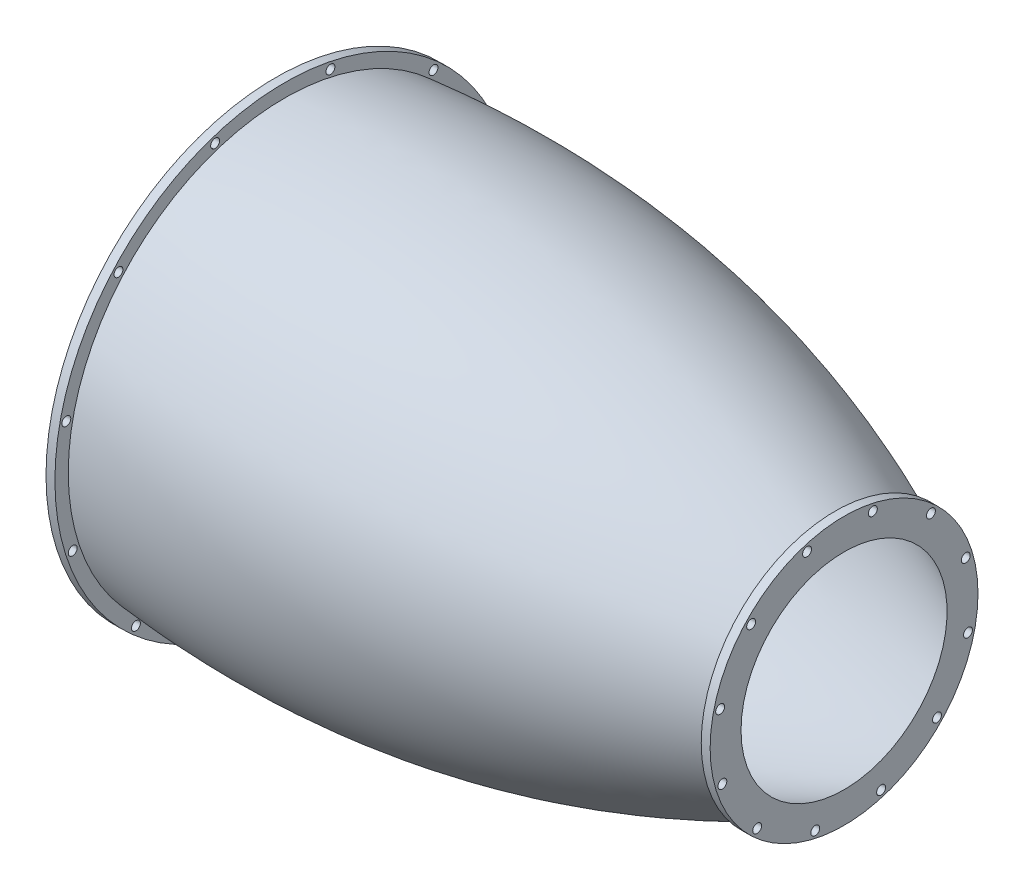
ISO-10303-21;
HEADER;
FILE_DESCRIPTION(('STEP AP214'),'2;1');
FILE_NAME('part.step','',(''),(''),'','','');
FILE_SCHEMA(('AUTOMOTIVE_DESIGN { 1 0 10303 214 1 1 1 1 }'));
ENDSEC;
DATA;
#1=APPLICATION_CONTEXT('core data for automotive mechanical design processes');
#2=APPLICATION_PROTOCOL_DEFINITION('international standard','automotive_design',2000,#1);
#3=PRODUCT_CONTEXT('',#1,'mechanical');
#4=PRODUCT('Part','Part','',(#3));
#5=PRODUCT_RELATED_PRODUCT_CATEGORY('part','',(#4));
#6=PRODUCT_DEFINITION_FORMATION('','',#4);
#7=PRODUCT_DEFINITION_CONTEXT('part definition',#1,'design');
#8=PRODUCT_DEFINITION('design','',#6,#7);
#9=PRODUCT_DEFINITION_SHAPE('','',#8);
#10=(LENGTH_UNIT() NAMED_UNIT(*) SI_UNIT(.MILLI.,.METRE.));
#11=(NAMED_UNIT(*) PLANE_ANGLE_UNIT() SI_UNIT($,.RADIAN.));
#12=(NAMED_UNIT(*) SI_UNIT($,.STERADIAN.) SOLID_ANGLE_UNIT());
#13=UNCERTAINTY_MEASURE_WITH_UNIT(LENGTH_MEASURE(1.E-05),#10,'distance_accuracy_value','');
#14=(GEOMETRIC_REPRESENTATION_CONTEXT(3) GLOBAL_UNCERTAINTY_ASSIGNED_CONTEXT((#13)) GLOBAL_UNIT_ASSIGNED_CONTEXT((#10,
#11,#12)) REPRESENTATION_CONTEXT('',''));
#15=CARTESIAN_POINT('',(0.,0.,0.));
#16=DIRECTION('',(0.,0.,1.));
#17=DIRECTION('',(1.,0.,0.));
#18=AXIS2_PLACEMENT_3D('',#15,#16,#17);
#19=CARTESIAN_POINT('',(-406.474178467712,0.,0.));
#20=DIRECTION('',(-1.,0.,0.));
#21=DIRECTION('',(0.,0.,1.));
#22=AXIS2_PLACEMENT_3D('',#19,#20,#21);
#23=PLANE('',#22);
#24=CARTESIAN_POINT('',(-406.474178467712,-151.163842279478,-49.6198833128808));
#25=DIRECTION('',(1.,0.,0.));
#26=DIRECTION('',(0.,0.500000000000001,-0.866025403784438));
#27=AXIS2_PLACEMENT_3D('',#24,#25,#26);
#28=CIRCLE('',#27,3.17499999999998);
#29=CARTESIAN_POINT('',(-406.474178467712,-149.576342279478,-52.3695139698964));
#30=VERTEX_POINT('',#29);
#31=EDGE_CURVE('E245',#30,#30,#28,.T.);
#32=ORIENTED_EDGE('',*,*,#31,.F.);
#33=EDGE_LOOP('',(#32));
#34=FACE_BOUND('',#33,.T.);
#35=CARTESIAN_POINT('',(-406.474178467712,-118.554000621515,106.101785891251));
#36=DIRECTION('',(1.,0.,0.));
#37=DIRECTION('',(0.,-0.499999999999989,-0.866025403784445));
#38=AXIS2_PLACEMENT_3D('',#35,#36,#37);
#39=CIRCLE('',#38,3.17499999999998);
#40=CARTESIAN_POINT('',(-406.474178467712,-120.141500621515,103.352155234235));
#41=VERTEX_POINT('',#40);
#42=EDGE_CURVE('E312',#41,#41,#39,.T.);
#43=ORIENTED_EDGE('',*,*,#42,.F.);
#44=EDGE_LOOP('',(#43));
#45=FACE_BOUND('',#44,.T.);
#46=CARTESIAN_POINT('',(-406.474178467712,-49.6198833128824,151.163842279478));
#47=DIRECTION('',(1.,0.,0.));
#48=DIRECTION('',(0.,-0.866025403784433,-0.50000000000001));
#49=AXIS2_PLACEMENT_3D('',#46,#47,#48);
#50=CIRCLE('',#49,3.17499999999998);
#51=CARTESIAN_POINT('',(-406.474178467712,-52.369513969898,149.576342279478));
#52=VERTEX_POINT('',#51);
#53=EDGE_CURVE('E255',#52,#52,#50,.T.);
#54=ORIENTED_EDGE('',*,*,#53,.F.);
#55=EDGE_LOOP('',(#54));
#56=FACE_BOUND('',#55,.T.);
#57=CARTESIAN_POINT('',(-406.474178467712,32.6098416579633,155.721669204133));
#58=DIRECTION('',(1.,0.,0.));
#59=DIRECTION('',(0.,-1.,0.));
#60=AXIS2_PLACEMENT_3D('',#57,#58,#59);
#61=CIRCLE('',#60,3.17499999999998);
#62=CARTESIAN_POINT('',(-406.474178467712,29.4348416579633,155.721669204133));
#63=VERTEX_POINT('',#62);
#64=EDGE_CURVE('E246',#63,#63,#61,.T.);
#65=ORIENTED_EDGE('',*,*,#64,.F.);
#66=EDGE_LOOP('',(#65));
#67=FACE_BOUND('',#66,.T.);
#68=CARTESIAN_POINT('',(-406.474178467712,106.101785891251,118.554000621514));
#69=DIRECTION('',(1.,0.,0.));
#70=DIRECTION('',(0.,-0.866025403784443,0.499999999999992));
#71=AXIS2_PLACEMENT_3D('',#68,#69,#70);
#72=CIRCLE('',#71,3.17499999999998);
#73=CARTESIAN_POINT('',(-406.474178467712,103.352155234235,120.141500621514));
#74=VERTEX_POINT('',#73);
#75=EDGE_CURVE('E256',#74,#74,#72,.T.);
#76=ORIENTED_EDGE('',*,*,#75,.F.);
#77=EDGE_LOOP('',(#76));
#78=FACE_BOUND('',#77,.T.);
#79=CARTESIAN_POINT('',(-406.474178467712,151.163842279478,49.6198833128819));
#80=DIRECTION('',(1.,0.,0.));
#81=DIRECTION('',(0.,-0.500000000000007,0.866025403784435));
#82=AXIS2_PLACEMENT_3D('',#79,#80,#81);
#83=CIRCLE('',#82,3.17499999999998);
#84=CARTESIAN_POINT('',(-406.474178467712,149.576342279478,52.3695139698974));
#85=VERTEX_POINT('',#84);
#86=EDGE_CURVE('E264',#85,#85,#83,.T.);
#87=ORIENTED_EDGE('',*,*,#86,.F.);
#88=EDGE_LOOP('',(#87));
#89=FACE_BOUND('',#88,.T.);
#90=CARTESIAN_POINT('',(-406.474178467712,155.721669204133,-32.6098416579649));
#91=DIRECTION('',(1.,0.,0.));
#92=DIRECTION('',(0.,0.,1.));
#93=AXIS2_PLACEMENT_3D('',#90,#91,#92);
#94=CIRCLE('',#93,3.17499999999998);
#95=CARTESIAN_POINT('',(-406.474178467712,155.721669204133,-29.434841657965));
#96=VERTEX_POINT('',#95);
#97=EDGE_CURVE('E272',#96,#96,#94,.T.);
#98=ORIENTED_EDGE('',*,*,#97,.F.);
#99=EDGE_LOOP('',(#98));
#100=FACE_BOUND('',#99,.T.);
#101=CARTESIAN_POINT('',(-406.474178467712,118.554000621514,-106.101785891251));
#102=DIRECTION('',(1.,0.,0.));
#103=DIRECTION('',(0.,0.499999999999995,0.866025403784442));
#104=AXIS2_PLACEMENT_3D('',#101,#102,#103);
#105=CIRCLE('',#104,3.17499999999998);
#106=CARTESIAN_POINT('',(-406.474178467712,120.141500621514,-103.352155234236));
#107=VERTEX_POINT('',#106);
#108=EDGE_CURVE('E280',#107,#107,#105,.T.);
#109=ORIENTED_EDGE('',*,*,#108,.F.);
#110=EDGE_LOOP('',(#109));
#111=FACE_BOUND('',#110,.T.);
#112=CARTESIAN_POINT('',(-406.474178467712,49.6198833128813,-151.163842279478));
#113=DIRECTION('',(1.,0.,0.));
#114=DIRECTION('',(0.,0.866025403784436,0.500000000000004));
#115=AXIS2_PLACEMENT_3D('',#112,#113,#114);
#116=CIRCLE('',#115,3.17499999999998);
#117=CARTESIAN_POINT('',(-406.474178467712,52.3695139698969,-149.576342279478));
#118=VERTEX_POINT('',#117);
#119=EDGE_CURVE('E288',#118,#118,#116,.T.);
#120=ORIENTED_EDGE('',*,*,#119,.F.);
#121=EDGE_LOOP('',(#120));
#122=FACE_BOUND('',#121,.T.);
#123=CARTESIAN_POINT('',(-406.474178467712,-32.6098416579644,-155.721669204133));
#124=DIRECTION('',(1.,0.,0.));
#125=DIRECTION('',(0.,1.,0.));
#126=AXIS2_PLACEMENT_3D('',#123,#124,#125);
#127=CIRCLE('',#126,3.17499999999998);
#128=CARTESIAN_POINT('',(-406.474178467712,-29.4348416579644,-155.721669204133));
#129=VERTEX_POINT('',#128);
#130=EDGE_CURVE('E296',#129,#129,#127,.T.);
#131=ORIENTED_EDGE('',*,*,#130,.F.);
#132=EDGE_LOOP('',(#131));
#133=FACE_BOUND('',#132,.T.);
#134=CARTESIAN_POINT('',(-406.474178467712,-106.101785891252,-118.554000621514));
#135=DIRECTION('',(1.,0.,0.));
#136=DIRECTION('',(0.,0.86602540378444,-0.499999999999998));
#137=AXIS2_PLACEMENT_3D('',#134,#135,#136);
#138=CIRCLE('',#137,3.17499999999998);
#139=CARTESIAN_POINT('',(-406.474178467712,-103.352155234236,-120.141500621514));
#140=VERTEX_POINT('',#139);
#141=EDGE_CURVE('E304',#140,#140,#138,.T.);
#142=ORIENTED_EDGE('',*,*,#141,.F.);
#143=EDGE_LOOP('',(#142));
#144=FACE_BOUND('',#143,.T.);
#145=CARTESIAN_POINT('',(-406.474178467712,0.,0.));
#146=DIRECTION('',(-1.,0.,0.));
#147=DIRECTION('',(0.,0.,1.));
#148=AXIS2_PLACEMENT_3D('',#145,#146,#147);
#149=CIRCLE('',#148,154.339060757013);
#150=CARTESIAN_POINT('',(-406.474178467712,0.,154.339060757013));
#151=VERTEX_POINT('',#150);
#152=EDGE_CURVE('E11',#151,#151,#149,.T.);
#153=ORIENTED_EDGE('',*,*,#152,.T.);
#154=EDGE_LOOP('',(#153));
#155=FACE_BOUND('',#154,.T.);
#156=CARTESIAN_POINT('',(-406.474178467712,0.,0.));
#157=DIRECTION('',(-1.,0.,0.));
#158=DIRECTION('',(0.,0.,1.));
#159=AXIS2_PLACEMENT_3D('',#156,#157,#158);
#160=CIRCLE('',#159,163.859870936221);
#161=CARTESIAN_POINT('',(-406.474178467712,0.,163.859870936221));
#162=VERTEX_POINT('',#161);
#163=EDGE_CURVE('E130',#162,#162,#160,.T.);
#164=ORIENTED_EDGE('',*,*,#163,.F.);
#165=EDGE_LOOP('',(#164));
#166=FACE_BOUND('',#165,.T.);
#167=CARTESIAN_POINT('',(-406.474178467712,-155.721669204133,32.6098416579649));
#168=DIRECTION('',(1.,0.,0.));
#169=DIRECTION('',(0.,0.,-1.));
#170=AXIS2_PLACEMENT_3D('',#167,#168,#169);
#171=CIRCLE('',#170,3.17499999999998);
#172=CARTESIAN_POINT('',(-406.474178467712,-155.721669204133,29.434841657965));
#173=VERTEX_POINT('',#172);
#174=EDGE_CURVE('E241',#173,#173,#171,.T.);
#175=ORIENTED_EDGE('',*,*,#174,.F.);
#176=EDGE_LOOP('',(#175));
#177=FACE_BOUND('',#176,.T.);
#178=ADVANCED_FACE('F45',(#34,#45,#56,#67,#78,#89,#100,#111,#122,#133,#144,#155,#166,#177),#23,.F.);
#179=CARTESIAN_POINT('',(0.,78.9939999999998,0.));
#180=CARTESIAN_POINT('',(-192.730394607075,176.706088879271,0.));
#181=CARTESIAN_POINT('',(-412.824178467712,153.699870936221,0.));
#182=B_SPLINE_CURVE_WITH_KNOTS('',2,(#179,#180,#181),.UNSPECIFIED.,.F.,.F.,(3,3),(0.,1.),.UNSPECIFIED.);
#183=CARTESIAN_POINT('',(-1229.82823928785,0.,0.));
#184=DIRECTION('',(-1.,0.,0.));
#185=AXIS1_PLACEMENT('',#183,#184);
#186=SURFACE_OF_REVOLUTION('',#182,#185);
#187=CARTESIAN_POINT('',(-13.97,0.,0.));
#188=DIRECTION('',(-1.,0.,0.));
#189=DIRECTION('',(0.,0.,1.));
#190=AXIS2_PLACEMENT_3D('',#187,#188,#189);
#191=CIRCLE('',#190,85.9007463354769);
#192=CARTESIAN_POINT('',(-13.97,0.,85.9007463354769));
#193=VERTEX_POINT('',#192);
#194=EDGE_CURVE('E54',#193,#193,#191,.F.);
#195=ORIENTED_EDGE('',*,*,#194,.F.);
#196=EDGE_LOOP('',(#195));
#197=FACE_BOUND('',#196,.T.);
#198=ORIENTED_EDGE('',*,*,#152,.F.);
#199=EDGE_LOOP('',(#198));
#200=FACE_BOUND('',#199,.T.);
#201=ADVANCED_FACE('F47',(#197,#200),#186,.T.);
#202=CARTESIAN_POINT('',(-412.824178467712,7.73329991096999E-12,0.));
#203=DIRECTION('',(-1.,0.,0.));
#204=DIRECTION('',(0.,0.,1.));
#205=AXIS2_PLACEMENT_3D('',#202,#203,#204);
#206=PLANE('',#205);
#207=CARTESIAN_POINT('',(-412.824178467712,-151.163842279478,-49.6198833128808));
#208=DIRECTION('',(1.,0.,0.));
#209=DIRECTION('',(0.,0.500000000000001,-0.866025403784438));
#210=AXIS2_PLACEMENT_3D('',#207,#208,#209);
#211=CIRCLE('',#210,3.17499999999998);
#212=CARTESIAN_POINT('',(-412.824178467712,-149.576342279478,-52.3695139698964));
#213=VERTEX_POINT('',#212);
#214=EDGE_CURVE('E308',#213,#213,#211,.T.);
#215=ORIENTED_EDGE('',*,*,#214,.T.);
#216=EDGE_LOOP('',(#215));
#217=FACE_BOUND('',#216,.T.);
#218=CARTESIAN_POINT('',(-412.824178467712,-118.554000621515,106.101785891251));
#219=DIRECTION('',(1.,0.,0.));
#220=DIRECTION('',(0.,-0.499999999999989,-0.866025403784445));
#221=AXIS2_PLACEMENT_3D('',#218,#219,#220);
#222=CIRCLE('',#221,3.17499999999998);
#223=CARTESIAN_POINT('',(-412.824178467712,-120.141500621515,103.352155234235));
#224=VERTEX_POINT('',#223);
#225=EDGE_CURVE('E317',#224,#224,#222,.T.);
#226=ORIENTED_EDGE('',*,*,#225,.T.);
#227=EDGE_LOOP('',(#226));
#228=FACE_BOUND('',#227,.T.);
#229=CARTESIAN_POINT('',(-412.824178467712,-49.6198833128824,151.163842279478));
#230=DIRECTION('',(1.,0.,0.));
#231=DIRECTION('',(0.,-0.866025403784433,-0.50000000000001));
#232=AXIS2_PLACEMENT_3D('',#229,#230,#231);
#233=CIRCLE('',#232,3.17499999999998);
#234=CARTESIAN_POINT('',(-412.824178467712,-52.369513969898,149.576342279478));
#235=VERTEX_POINT('',#234);
#236=EDGE_CURVE('E316',#235,#235,#233,.T.);
#237=ORIENTED_EDGE('',*,*,#236,.T.);
#238=EDGE_LOOP('',(#237));
#239=FACE_BOUND('',#238,.T.);
#240=CARTESIAN_POINT('',(-412.824178467712,32.6098416579633,155.721669204133));
#241=DIRECTION('',(1.,0.,0.));
#242=DIRECTION('',(0.,-1.,0.));
#243=AXIS2_PLACEMENT_3D('',#240,#241,#242);
#244=CIRCLE('',#243,3.17499999999998);
#245=CARTESIAN_POINT('',(-412.824178467712,29.4348416579633,155.721669204133));
#246=VERTEX_POINT('',#245);
#247=EDGE_CURVE('E251',#246,#246,#244,.T.);
#248=ORIENTED_EDGE('',*,*,#247,.T.);
#249=EDGE_LOOP('',(#248));
#250=FACE_BOUND('',#249,.T.);
#251=CARTESIAN_POINT('',(-412.824178467712,106.101785891251,118.554000621514));
#252=DIRECTION('',(1.,0.,0.));
#253=DIRECTION('',(0.,-0.866025403784443,0.499999999999992));
#254=AXIS2_PLACEMENT_3D('',#251,#252,#253);
#255=CIRCLE('',#254,3.17499999999998);
#256=CARTESIAN_POINT('',(-412.824178467712,103.352155234235,120.141500621514));
#257=VERTEX_POINT('',#256);
#258=EDGE_CURVE('E250',#257,#257,#255,.T.);
#259=ORIENTED_EDGE('',*,*,#258,.T.);
#260=EDGE_LOOP('',(#259));
#261=FACE_BOUND('',#260,.T.);
#262=CARTESIAN_POINT('',(-412.824178467712,151.163842279478,49.6198833128819));
#263=DIRECTION('',(1.,0.,0.));
#264=DIRECTION('',(0.,-0.500000000000007,0.866025403784435));
#265=AXIS2_PLACEMENT_3D('',#262,#263,#264);
#266=CIRCLE('',#265,3.17499999999998);
#267=CARTESIAN_POINT('',(-412.824178467712,149.576342279478,52.3695139698974));
#268=VERTEX_POINT('',#267);
#269=EDGE_CURVE('E260',#268,#268,#266,.T.);
#270=ORIENTED_EDGE('',*,*,#269,.T.);
#271=EDGE_LOOP('',(#270));
#272=FACE_BOUND('',#271,.T.);
#273=CARTESIAN_POINT('',(-412.824178467712,155.721669204133,-32.6098416579649));
#274=DIRECTION('',(1.,0.,0.));
#275=DIRECTION('',(0.,0.,1.));
#276=AXIS2_PLACEMENT_3D('',#273,#274,#275);
#277=CIRCLE('',#276,3.17499999999998);
#278=CARTESIAN_POINT('',(-412.824178467712,155.721669204133,-29.434841657965));
#279=VERTEX_POINT('',#278);
#280=EDGE_CURVE('E268',#279,#279,#277,.T.);
#281=ORIENTED_EDGE('',*,*,#280,.T.);
#282=EDGE_LOOP('',(#281));
#283=FACE_BOUND('',#282,.T.);
#284=CARTESIAN_POINT('',(-412.824178467712,118.554000621514,-106.101785891251));
#285=DIRECTION('',(1.,0.,0.));
#286=DIRECTION('',(0.,0.499999999999995,0.866025403784442));
#287=AXIS2_PLACEMENT_3D('',#284,#285,#286);
#288=CIRCLE('',#287,3.17499999999998);
#289=CARTESIAN_POINT('',(-412.824178467712,120.141500621514,-103.352155234236));
#290=VERTEX_POINT('',#289);
#291=EDGE_CURVE('E276',#290,#290,#288,.T.);
#292=ORIENTED_EDGE('',*,*,#291,.T.);
#293=EDGE_LOOP('',(#292));
#294=FACE_BOUND('',#293,.T.);
#295=CARTESIAN_POINT('',(-412.824178467712,49.6198833128813,-151.163842279478));
#296=DIRECTION('',(1.,0.,0.));
#297=DIRECTION('',(0.,0.866025403784436,0.500000000000004));
#298=AXIS2_PLACEMENT_3D('',#295,#296,#297);
#299=CIRCLE('',#298,3.17499999999998);
#300=CARTESIAN_POINT('',(-412.824178467712,52.3695139698969,-149.576342279478));
#301=VERTEX_POINT('',#300);
#302=EDGE_CURVE('E284',#301,#301,#299,.T.);
#303=ORIENTED_EDGE('',*,*,#302,.T.);
#304=EDGE_LOOP('',(#303));
#305=FACE_BOUND('',#304,.T.);
#306=CARTESIAN_POINT('',(-412.824178467712,-32.6098416579644,-155.721669204133));
#307=DIRECTION('',(1.,0.,0.));
#308=DIRECTION('',(0.,1.,0.));
#309=AXIS2_PLACEMENT_3D('',#306,#307,#308);
#310=CIRCLE('',#309,3.17499999999998);
#311=CARTESIAN_POINT('',(-412.824178467712,-29.4348416579644,-155.721669204133));
#312=VERTEX_POINT('',#311);
#313=EDGE_CURVE('E292',#312,#312,#310,.T.);
#314=ORIENTED_EDGE('',*,*,#313,.T.);
#315=EDGE_LOOP('',(#314));
#316=FACE_BOUND('',#315,.T.);
#317=CARTESIAN_POINT('',(-412.824178467712,-106.101785891252,-118.554000621514));
#318=DIRECTION('',(1.,0.,0.));
#319=DIRECTION('',(0.,0.86602540378444,-0.499999999999998));
#320=AXIS2_PLACEMENT_3D('',#317,#318,#319);
#321=CIRCLE('',#320,3.17499999999998);
#322=CARTESIAN_POINT('',(-412.824178467712,-103.352155234236,-120.141500621514));
#323=VERTEX_POINT('',#322);
#324=EDGE_CURVE('E300',#323,#323,#321,.T.);
#325=ORIENTED_EDGE('',*,*,#324,.T.);
#326=EDGE_LOOP('',(#325));
#327=FACE_BOUND('',#326,.T.);
#328=CARTESIAN_POINT('',(-412.824178467712,-155.721669204133,32.6098416579649));
#329=DIRECTION('',(1.,0.,0.));
#330=DIRECTION('',(0.,0.,-1.));
#331=AXIS2_PLACEMENT_3D('',#328,#329,#330);
#332=CIRCLE('',#331,3.17499999999998);
#333=CARTESIAN_POINT('',(-412.824178467712,-155.721669204133,29.434841657965));
#334=VERTEX_POINT('',#333);
#335=EDGE_CURVE('E167',#334,#334,#332,.T.);
#336=ORIENTED_EDGE('',*,*,#335,.T.);
#337=EDGE_LOOP('',(#336));
#338=FACE_BOUND('',#337,.T.);
#339=CARTESIAN_POINT('',(-412.824178467712,0.,0.));
#340=DIRECTION('',(-1.,0.,0.));
#341=DIRECTION('',(0.,0.,1.));
#342=AXIS2_PLACEMENT_3D('',#339,#340,#341);
#343=CIRCLE('',#342,144.809870936221);
#344=CARTESIAN_POINT('',(-412.824178467712,0.,144.809870936221));
#345=VERTEX_POINT('',#344);
#346=EDGE_CURVE('E59',#345,#345,#343,.T.);
#347=ORIENTED_EDGE('',*,*,#346,.F.);
#348=EDGE_LOOP('',(#347));
#349=FACE_BOUND('',#348,.T.);
#350=CARTESIAN_POINT('',(-412.824178467712,0.,0.));
#351=DIRECTION('',(-1.,0.,0.));
#352=DIRECTION('',(0.,0.,1.));
#353=AXIS2_PLACEMENT_3D('',#350,#351,#352);
#354=CIRCLE('',#353,163.859870936221);
#355=CARTESIAN_POINT('',(-412.824178467712,0.,163.859870936221));
#356=VERTEX_POINT('',#355);
#357=EDGE_CURVE('E135',#356,#356,#354,.T.);
#358=ORIENTED_EDGE('',*,*,#357,.T.);
#359=EDGE_LOOP('',(#358));
#360=FACE_BOUND('',#359,.T.);
#361=ADVANCED_FACE('F86',(#217,#228,#239,#250,#261,#272,#283,#294,#305,#316,#327,#338,#349,
#360),#206,.T.);
#362=CARTESIAN_POINT('',(0.,70.1039999999998,0.));
#363=CARTESIAN_POINT('',(-195.449728046968,157.410787997723,0.));
#364=CARTESIAN_POINT('',(-412.824178467712,144.809870936221,0.));
#365=B_SPLINE_CURVE_WITH_KNOTS('',2,(#362,#363,#364),.UNSPECIFIED.,.F.,.F.,(3,3),(0.,1.),.UNSPECIFIED.);
#366=CARTESIAN_POINT('',(-1229.82823928785,0.,0.));
#367=DIRECTION('',(-1.,0.,0.));
#368=AXIS1_PLACEMENT('',#366,#367);
#369=SURFACE_OF_REVOLUTION('',#365,#368);
#370=CARTESIAN_POINT('',(-7.61999999999996,0.,0.));
#371=DIRECTION('',(-1.,0.,0.));
#372=DIRECTION('',(0.,0.,1.));
#373=AXIS2_PLACEMENT_3D('',#370,#371,#372);
#374=CIRCLE('',#373,73.4662351266417);
#375=CARTESIAN_POINT('',(-7.61999999999996,0.,73.4662351266417));
#376=VERTEX_POINT('',#375);
#377=EDGE_CURVE('E64',#376,#376,#374,.T.);
#378=ORIENTED_EDGE('',*,*,#377,.F.);
#379=EDGE_LOOP('',(#378));
#380=FACE_BOUND('',#379,.T.);
#381=ORIENTED_EDGE('',*,*,#346,.T.);
#382=EDGE_LOOP('',(#381));
#383=FACE_BOUND('',#382,.T.);
#384=ADVANCED_FACE('F82',(#380,#383),#369,.F.);
#385=CARTESIAN_POINT('',(-7.62,0.,0.));
#386=DIRECTION('',(-1.,0.,0.));
#387=DIRECTION('',(0.,0.,1.));
#388=AXIS2_PLACEMENT_3D('',#385,#386,#387);
#389=PLANE('',#388);
#390=CARTESIAN_POINT('',(-7.62000000000011,-86.7738429373262,-26.4063134782297));
#391=DIRECTION('',(-1.,0.,0.));
#392=DIRECTION('',(0.,-0.499999999999989,0.866025403784445));
#393=AXIS2_PLACEMENT_3D('',#390,#391,#392);
#394=CIRCLE('',#393,3.17499999999998);
#395=CARTESIAN_POINT('',(-7.62000000000011,-88.3613429373261,-23.6566828212141));
#396=VERTEX_POINT('',#395);
#397=EDGE_CURVE('E163',#396,#396,#394,.T.);
#398=ORIENTED_EDGE('',*,*,#397,.T.);
#399=EDGE_LOOP('',(#398));
#400=FACE_BOUND('',#399,.T.);
#401=CARTESIAN_POINT('',(-7.62000000000011,-61.9451956286104,-66.2554597611055));
#402=DIRECTION('',(-1.,0.,0.));
#403=DIRECTION('',(0.,-0.866025403784433,0.50000000000001));
#404=AXIS2_PLACEMENT_3D('',#401,#402,#403);
#405=CIRCLE('',#404,3.17499999999998);
#406=CARTESIAN_POINT('',(-7.62000000000011,-64.694826285626,-64.6679597611055));
#407=VERTEX_POINT('',#406);
#408=EDGE_CURVE('E162',#407,#407,#405,.T.);
#409=ORIENTED_EDGE('',*,*,#408,.T.);
#410=EDGE_LOOP('',(#409));
#411=FACE_BOUND('',#410,.T.);
#412=CARTESIAN_POINT('',(-7.62000000000011,-20.5183831762205,-88.3515091068403));
#413=DIRECTION('',(-1.,0.,0.));
#414=DIRECTION('',(0.,-1.,0.));
#415=AXIS2_PLACEMENT_3D('',#412,#413,#414);
#416=CIRCLE('',#415,3.17499999999998);
#417=CARTESIAN_POINT('',(-7.62000000000011,-23.6933831762205,-88.3515091068403));
#418=VERTEX_POINT('',#417);
#419=EDGE_CURVE('E172',#418,#418,#416,.T.);
#420=ORIENTED_EDGE('',*,*,#419,.T.);
#421=EDGE_LOOP('',(#420));
#422=FACE_BOUND('',#421,.T.);
#423=CARTESIAN_POINT('',(-7.62000000000011,26.40631347823,-86.7738429373261));
#424=DIRECTION('',(-1.,0.,0.));
#425=DIRECTION('',(0.,-0.866025403784443,-0.499999999999992));
#426=AXIS2_PLACEMENT_3D('',#423,#424,#425);
#427=CIRCLE('',#426,3.17499999999998);
#428=CARTESIAN_POINT('',(-7.62000000000011,23.6566828212144,-88.3613429373261));
#429=VERTEX_POINT('',#428);
#430=EDGE_CURVE('E180',#429,#429,#427,.T.);
#431=ORIENTED_EDGE('',*,*,#430,.T.);
#432=EDGE_LOOP('',(#431));
#433=FACE_BOUND('',#432,.T.);
#434=CARTESIAN_POINT('',(-7.62000000000011,66.2554597611058,-61.9451956286102));
#435=DIRECTION('',(-1.,0.,0.));
#436=DIRECTION('',(0.,-0.500000000000007,-0.866025403784435));
#437=AXIS2_PLACEMENT_3D('',#434,#435,#436);
#438=CIRCLE('',#437,3.17499999999998);
#439=CARTESIAN_POINT('',(-7.62000000000011,64.6679597611057,-64.6948262856258));
#440=VERTEX_POINT('',#439);
#441=EDGE_CURVE('E188',#440,#440,#438,.T.);
#442=ORIENTED_EDGE('',*,*,#441,.T.);
#443=EDGE_LOOP('',(#442));
#444=FACE_BOUND('',#443,.T.);
#445=CARTESIAN_POINT('',(-7.62000000000011,88.3515091068405,-20.5183831762196));
#446=DIRECTION('',(-1.,0.,0.));
#447=DIRECTION('',(0.,0.,-1.));
#448=AXIS2_PLACEMENT_3D('',#445,#446,#447);
#449=CIRCLE('',#448,3.17499999999998);
#450=CARTESIAN_POINT('',(-7.62000000000011,88.3515091068405,-23.6933831762196));
#451=VERTEX_POINT('',#450);
#452=EDGE_CURVE('E196',#451,#451,#449,.T.);
#453=ORIENTED_EDGE('',*,*,#452,.T.);
#454=EDGE_LOOP('',(#453));
#455=FACE_BOUND('',#454,.T.);
#456=CARTESIAN_POINT('',(-7.62000000000011,86.773842937326,26.4063134782303));
#457=DIRECTION('',(-1.,0.,0.));
#458=DIRECTION('',(0.,0.499999999999995,-0.866025403784442));
#459=AXIS2_PLACEMENT_3D('',#456,#457,#458);
#460=CIRCLE('',#459,3.17499999999998);
#461=CARTESIAN_POINT('',(-7.62000000000011,88.361342937326,23.6566828212147));
#462=VERTEX_POINT('',#461);
#463=EDGE_CURVE('E204',#462,#462,#460,.T.);
#464=ORIENTED_EDGE('',*,*,#463,.T.);
#465=EDGE_LOOP('',(#464));
#466=FACE_BOUND('',#465,.T.);
#467=CARTESIAN_POINT('',(-7.62000000000011,61.94519562861,66.255459761106));
#468=DIRECTION('',(-1.,0.,0.));
#469=DIRECTION('',(0.,0.866025403784436,-0.500000000000004));
#470=AXIS2_PLACEMENT_3D('',#467,#468,#469);
#471=CIRCLE('',#470,3.17499999999998);
#472=CARTESIAN_POINT('',(-7.62000000000011,64.6948262856256,64.667959761106));
#473=VERTEX_POINT('',#472);
#474=EDGE_CURVE('E212',#473,#473,#471,.T.);
#475=ORIENTED_EDGE('',*,*,#474,.T.);
#476=EDGE_LOOP('',(#475));
#477=FACE_BOUND('',#476,.T.);
#478=CARTESIAN_POINT('',(-7.62000000000011,20.5183831762199,88.3515091068404));
#479=DIRECTION('',(-1.,0.,0.));
#480=DIRECTION('',(0.,1.,0.));
#481=AXIS2_PLACEMENT_3D('',#478,#479,#480);
#482=CIRCLE('',#481,3.17499999999998);
#483=CARTESIAN_POINT('',(-7.62000000000011,23.6933831762199,88.3515091068404));
#484=VERTEX_POINT('',#483);
#485=EDGE_CURVE('E220',#484,#484,#482,.T.);
#486=ORIENTED_EDGE('',*,*,#485,.T.);
#487=EDGE_LOOP('',(#486));
#488=FACE_BOUND('',#487,.T.);
#489=CARTESIAN_POINT('',(-7.62000000000011,-26.4063134782306,86.7738429373259));
#490=DIRECTION('',(-1.,0.,0.));
#491=DIRECTION('',(0.,0.86602540378444,0.499999999999998));
#492=AXIS2_PLACEMENT_3D('',#489,#490,#491);
#493=CIRCLE('',#492,3.17499999999998);
#494=CARTESIAN_POINT('',(-7.62000000000011,-23.6566828212151,88.3613429373259));
#495=VERTEX_POINT('',#494);
#496=EDGE_CURVE('E228',#495,#495,#493,.T.);
#497=ORIENTED_EDGE('',*,*,#496,.T.);
#498=EDGE_LOOP('',(#497));
#499=FACE_BOUND('',#498,.T.);
#500=CARTESIAN_POINT('',(-7.62000000000011,-66.2554597611062,61.9451956286097));
#501=DIRECTION('',(-1.,0.,0.));
#502=DIRECTION('',(0.,0.500000000000001,0.866025403784438));
#503=AXIS2_PLACEMENT_3D('',#500,#501,#502);
#504=CIRCLE('',#503,3.17499999999998);
#505=CARTESIAN_POINT('',(-7.62000000000011,-64.6679597611062,64.6948262856253));
#506=VERTEX_POINT('',#505);
#507=EDGE_CURVE('E153',#506,#506,#504,.T.);
#508=ORIENTED_EDGE('',*,*,#507,.T.);
#509=EDGE_LOOP('',(#508));
#510=FACE_BOUND('',#509,.T.);
#511=CARTESIAN_POINT('',(-7.62000000000011,-88.3515091068405,20.5183831762196));
#512=DIRECTION('',(-1.,0.,0.));
#513=DIRECTION('',(0.,0.,1.));
#514=AXIS2_PLACEMENT_3D('',#511,#512,#513);
#515=CIRCLE('',#514,3.17499999999998);
#516=CARTESIAN_POINT('',(-7.62000000000011,-88.3515091068405,23.6933831762196));
#517=VERTEX_POINT('',#516);
#518=EDGE_CURVE('E140',#517,#517,#515,.T.);
#519=ORIENTED_EDGE('',*,*,#518,.T.);
#520=EDGE_LOOP('',(#519));
#521=FACE_BOUND('',#520,.T.);
#522=ORIENTED_EDGE('',*,*,#377,.T.);
#523=EDGE_LOOP('',(#522));
#524=FACE_BOUND('',#523,.T.);
#525=CARTESIAN_POINT('',(-7.61999999999996,0.,0.));
#526=DIRECTION('',(1.,0.,0.));
#527=DIRECTION('',(0.,0.,-1.));
#528=AXIS2_PLACEMENT_3D('',#525,#526,#527);
#529=CIRCLE('',#528,95.5048016460807);
#530=CARTESIAN_POINT('',(-7.61999999999996,0.,-95.5048016460807));
#531=VERTEX_POINT('',#530);
#532=EDGE_CURVE('E127',#531,#531,#529,.T.);
#533=ORIENTED_EDGE('',*,*,#532,.T.);
#534=EDGE_LOOP('',(#533));
#535=FACE_BOUND('',#534,.T.);
#536=ADVANCED_FACE('F85',(#400,#411,#422,#433,#444,#455,#466,#477,#488,#499,#510,#521,#524,
#535),#389,.F.);
#537=CARTESIAN_POINT('',(-13.9700000000001,0.,0.));
#538=DIRECTION('',(1.,0.,0.));
#539=DIRECTION('',(0.,0.,-1.));
#540=AXIS2_PLACEMENT_3D('',#537,#538,#539);
#541=CYLINDRICAL_SURFACE('',#540,95.5048016460807);
#542=CARTESIAN_POINT('',(-13.9700000000001,0.,0.));
#543=DIRECTION('',(1.,0.,0.));
#544=DIRECTION('',(0.,0.,-1.));
#545=AXIS2_PLACEMENT_3D('',#542,#543,#544);
#546=CIRCLE('',#545,95.5048016460807);
#547=CARTESIAN_POINT('',(-13.9700000000001,0.,-95.5048016460807));
#548=VERTEX_POINT('',#547);
#549=EDGE_CURVE('E69',#548,#548,#546,.T.);
#550=ORIENTED_EDGE('',*,*,#549,.T.);
#551=EDGE_LOOP('',(#550));
#552=FACE_BOUND('',#551,.T.);
#553=ORIENTED_EDGE('',*,*,#532,.F.);
#554=EDGE_LOOP('',(#553));
#555=FACE_BOUND('',#554,.T.);
#556=ADVANCED_FACE('F114',(#552,#555),#541,.T.);
#557=CARTESIAN_POINT('',(-13.9700000000001,0.,0.));
#558=DIRECTION('',(1.,0.,0.));
#559=DIRECTION('',(0.,0.,-1.));
#560=AXIS2_PLACEMENT_3D('',#557,#558,#559);
#561=PLANE('',#560);
#562=CARTESIAN_POINT('',(-13.9700000000001,-86.7738429373262,-26.4063134782297));
#563=DIRECTION('',(-1.,0.,0.));
#564=DIRECTION('',(0.,-0.499999999999989,0.866025403784445));
#565=AXIS2_PLACEMENT_3D('',#562,#563,#564);
#566=CIRCLE('',#565,3.17499999999998);
#567=CARTESIAN_POINT('',(-13.9700000000001,-88.3613429373261,-23.6566828212141));
#568=VERTEX_POINT('',#567);
#569=EDGE_CURVE('E158',#568,#568,#566,.T.);
#570=ORIENTED_EDGE('',*,*,#569,.F.);
#571=EDGE_LOOP('',(#570));
#572=FACE_BOUND('',#571,.T.);
#573=CARTESIAN_POINT('',(-13.9700000000001,-61.9451956286104,-66.2554597611055));
#574=DIRECTION('',(-1.,0.,0.));
#575=DIRECTION('',(0.,-0.866025403784433,0.50000000000001));
#576=AXIS2_PLACEMENT_3D('',#573,#574,#575);
#577=CIRCLE('',#576,3.17499999999998);
#578=CARTESIAN_POINT('',(-13.9700000000001,-64.694826285626,-64.6679597611055));
#579=VERTEX_POINT('',#578);
#580=EDGE_CURVE('E168',#579,#579,#577,.T.);
#581=ORIENTED_EDGE('',*,*,#580,.F.);
#582=EDGE_LOOP('',(#581));
#583=FACE_BOUND('',#582,.T.);
#584=CARTESIAN_POINT('',(-13.9700000000001,-20.5183831762205,-88.3515091068403));
#585=DIRECTION('',(-1.,0.,0.));
#586=DIRECTION('',(0.,-1.,0.));
#587=AXIS2_PLACEMENT_3D('',#584,#585,#586);
#588=CIRCLE('',#587,3.17499999999998);
#589=CARTESIAN_POINT('',(-13.9700000000001,-23.6933831762205,-88.3515091068403));
#590=VERTEX_POINT('',#589);
#591=EDGE_CURVE('E176',#590,#590,#588,.T.);
#592=ORIENTED_EDGE('',*,*,#591,.F.);
#593=EDGE_LOOP('',(#592));
#594=FACE_BOUND('',#593,.T.);
#595=CARTESIAN_POINT('',(-13.9700000000001,26.40631347823,-86.7738429373261));
#596=DIRECTION('',(-1.,0.,0.));
#597=DIRECTION('',(0.,-0.866025403784443,-0.499999999999992));
#598=AXIS2_PLACEMENT_3D('',#595,#596,#597);
#599=CIRCLE('',#598,3.17499999999998);
#600=CARTESIAN_POINT('',(-13.9700000000001,23.6566828212144,-88.3613429373261));
#601=VERTEX_POINT('',#600);
#602=EDGE_CURVE('E184',#601,#601,#599,.T.);
#603=ORIENTED_EDGE('',*,*,#602,.F.);
#604=EDGE_LOOP('',(#603));
#605=FACE_BOUND('',#604,.T.);
#606=CARTESIAN_POINT('',(-13.9700000000001,66.2554597611058,-61.9451956286102));
#607=DIRECTION('',(-1.,0.,0.));
#608=DIRECTION('',(0.,-0.500000000000007,-0.866025403784435));
#609=AXIS2_PLACEMENT_3D('',#606,#607,#608);
#610=CIRCLE('',#609,3.17499999999998);
#611=CARTESIAN_POINT('',(-13.9700000000001,64.6679597611057,-64.6948262856258));
#612=VERTEX_POINT('',#611);
#613=EDGE_CURVE('E192',#612,#612,#610,.T.);
#614=ORIENTED_EDGE('',*,*,#613,.F.);
#615=EDGE_LOOP('',(#614));
#616=FACE_BOUND('',#615,.T.);
#617=CARTESIAN_POINT('',(-13.9700000000001,88.3515091068405,-20.5183831762196));
#618=DIRECTION('',(-1.,0.,0.));
#619=DIRECTION('',(0.,0.,-1.));
#620=AXIS2_PLACEMENT_3D('',#617,#618,#619);
#621=CIRCLE('',#620,3.17499999999998);
#622=CARTESIAN_POINT('',(-13.9700000000001,88.3515091068405,-23.6933831762196));
#623=VERTEX_POINT('',#622);
#624=EDGE_CURVE('E200',#623,#623,#621,.T.);
#625=ORIENTED_EDGE('',*,*,#624,.F.);
#626=EDGE_LOOP('',(#625));
#627=FACE_BOUND('',#626,.T.);
#628=CARTESIAN_POINT('',(-13.9700000000001,86.773842937326,26.4063134782303));
#629=DIRECTION('',(-1.,0.,0.));
#630=DIRECTION('',(0.,0.499999999999995,-0.866025403784442));
#631=AXIS2_PLACEMENT_3D('',#628,#629,#630);
#632=CIRCLE('',#631,3.17499999999998);
#633=CARTESIAN_POINT('',(-13.9700000000001,88.361342937326,23.6566828212147));
#634=VERTEX_POINT('',#633);
#635=EDGE_CURVE('E208',#634,#634,#632,.T.);
#636=ORIENTED_EDGE('',*,*,#635,.F.);
#637=EDGE_LOOP('',(#636));
#638=FACE_BOUND('',#637,.T.);
#639=CARTESIAN_POINT('',(-13.9700000000001,61.94519562861,66.255459761106));
#640=DIRECTION('',(-1.,0.,0.));
#641=DIRECTION('',(0.,0.866025403784436,-0.500000000000004));
#642=AXIS2_PLACEMENT_3D('',#639,#640,#641);
#643=CIRCLE('',#642,3.17499999999998);
#644=CARTESIAN_POINT('',(-13.9700000000001,64.6948262856256,64.667959761106));
#645=VERTEX_POINT('',#644);
#646=EDGE_CURVE('E216',#645,#645,#643,.T.);
#647=ORIENTED_EDGE('',*,*,#646,.F.);
#648=EDGE_LOOP('',(#647));
#649=FACE_BOUND('',#648,.T.);
#650=CARTESIAN_POINT('',(-13.9700000000001,20.5183831762199,88.3515091068404));
#651=DIRECTION('',(-1.,0.,0.));
#652=DIRECTION('',(0.,1.,0.));
#653=AXIS2_PLACEMENT_3D('',#650,#651,#652);
#654=CIRCLE('',#653,3.17499999999998);
#655=CARTESIAN_POINT('',(-13.9700000000001,23.6933831762199,88.3515091068404));
#656=VERTEX_POINT('',#655);
#657=EDGE_CURVE('E224',#656,#656,#654,.T.);
#658=ORIENTED_EDGE('',*,*,#657,.F.);
#659=EDGE_LOOP('',(#658));
#660=FACE_BOUND('',#659,.T.);
#661=CARTESIAN_POINT('',(-13.9700000000001,-26.4063134782306,86.7738429373259));
#662=DIRECTION('',(-1.,0.,0.));
#663=DIRECTION('',(0.,0.86602540378444,0.499999999999998));
#664=AXIS2_PLACEMENT_3D('',#661,#662,#663);
#665=CIRCLE('',#664,3.17499999999998);
#666=CARTESIAN_POINT('',(-13.9700000000001,-23.6566828212151,88.3613429373259));
#667=VERTEX_POINT('',#666);
#668=EDGE_CURVE('E157',#667,#667,#665,.T.);
#669=ORIENTED_EDGE('',*,*,#668,.F.);
#670=EDGE_LOOP('',(#669));
#671=FACE_BOUND('',#670,.T.);
#672=CARTESIAN_POINT('',(-13.9700000000001,-66.2554597611062,61.9451956286097));
#673=DIRECTION('',(-1.,0.,0.));
#674=DIRECTION('',(0.,0.500000000000001,0.866025403784438));
#675=AXIS2_PLACEMENT_3D('',#672,#673,#674);
#676=CIRCLE('',#675,3.17499999999998);
#677=CARTESIAN_POINT('',(-13.9700000000001,-64.6679597611062,64.6948262856253));
#678=VERTEX_POINT('',#677);
#679=EDGE_CURVE('E149',#678,#678,#676,.T.);
#680=ORIENTED_EDGE('',*,*,#679,.F.);
#681=EDGE_LOOP('',(#680));
#682=FACE_BOUND('',#681,.T.);
#683=CARTESIAN_POINT('',(-13.9700000000001,-88.3515091068405,20.5183831762196));
#684=DIRECTION('',(-1.,0.,0.));
#685=DIRECTION('',(0.,0.,1.));
#686=AXIS2_PLACEMENT_3D('',#683,#684,#685);
#687=CIRCLE('',#686,3.17499999999998);
#688=CARTESIAN_POINT('',(-13.9700000000001,-88.3515091068405,23.6933831762196));
#689=VERTEX_POINT('',#688);
#690=EDGE_CURVE('E145',#689,#689,#687,.T.);
#691=ORIENTED_EDGE('',*,*,#690,.F.);
#692=EDGE_LOOP('',(#691));
#693=FACE_BOUND('',#692,.T.);
#694=ORIENTED_EDGE('',*,*,#194,.T.);
#695=EDGE_LOOP('',(#694));
#696=FACE_BOUND('',#695,.T.);
#697=ORIENTED_EDGE('',*,*,#549,.F.);
#698=EDGE_LOOP('',(#697));
#699=FACE_BOUND('',#698,.T.);
#700=ADVANCED_FACE('F111',(#572,#583,#594,#605,#616,#627,#638,#649,#660,#671,#682,#693,#696,
#699),#561,.F.);
#701=CARTESIAN_POINT('',(-406.474178467712,0.,0.));
#702=DIRECTION('',(-1.,0.,0.));
#703=DIRECTION('',(0.,0.,1.));
#704=AXIS2_PLACEMENT_3D('',#701,#702,#703);
#705=CYLINDRICAL_SURFACE('',#704,163.859870936221);
#706=ORIENTED_EDGE('',*,*,#163,.T.);
#707=EDGE_LOOP('',(#706));
#708=FACE_BOUND('',#707,.T.);
#709=ORIENTED_EDGE('',*,*,#357,.F.);
#710=EDGE_LOOP('',(#709));
#711=FACE_BOUND('',#710,.T.);
#712=ADVANCED_FACE('F108',(#708,#711),#705,.T.);
#713=CARTESIAN_POINT('',(-13.9700000000001,-88.3515091068405,20.5183831762196));
#714=DIRECTION('',(-1.,0.,0.));
#715=DIRECTION('',(0.,0.,1.));
#716=AXIS2_PLACEMENT_3D('',#713,#714,#715);
#717=CYLINDRICAL_SURFACE('',#716,3.17499999999998);
#718=ORIENTED_EDGE('',*,*,#518,.F.);
#719=EDGE_LOOP('',(#718));
#720=FACE_BOUND('',#719,.T.);
#721=ORIENTED_EDGE('',*,*,#690,.T.);
#722=EDGE_LOOP('',(#721));
#723=FACE_BOUND('',#722,.T.);
#724=ADVANCED_FACE('F106',(#720,#723),#717,.F.);
#725=CARTESIAN_POINT('',(-13.9700000000001,-66.2554597611062,61.9451956286097));
#726=DIRECTION('',(-1.,0.,0.));
#727=DIRECTION('',(0.,0.500000000000001,0.866025403784438));
#728=AXIS2_PLACEMENT_3D('',#725,#726,#727);
#729=CYLINDRICAL_SURFACE('',#728,3.17499999999998);
#730=ORIENTED_EDGE('',*,*,#507,.F.);
#731=EDGE_LOOP('',(#730));
#732=FACE_BOUND('',#731,.T.);
#733=ORIENTED_EDGE('',*,*,#679,.T.);
#734=EDGE_LOOP('',(#733));
#735=FACE_BOUND('',#734,.T.);
#736=ADVANCED_FACE('F389',(#732,#735),#729,.F.);
#737=CARTESIAN_POINT('',(-13.9700000000001,-26.4063134782306,86.7738429373259));
#738=DIRECTION('',(-1.,0.,0.));
#739=DIRECTION('',(0.,0.86602540378444,0.499999999999998));
#740=AXIS2_PLACEMENT_3D('',#737,#738,#739);
#741=CYLINDRICAL_SURFACE('',#740,3.17499999999998);
#742=ORIENTED_EDGE('',*,*,#496,.F.);
#743=EDGE_LOOP('',(#742));
#744=FACE_BOUND('',#743,.T.);
#745=ORIENTED_EDGE('',*,*,#668,.T.);
#746=EDGE_LOOP('',(#745));
#747=FACE_BOUND('',#746,.T.);
#748=ADVANCED_FACE('F385',(#744,#747),#741,.F.);
#749=CARTESIAN_POINT('',(-13.9700000000001,20.5183831762199,88.3515091068404));
#750=DIRECTION('',(-1.,0.,0.));
#751=DIRECTION('',(0.,1.,0.));
#752=AXIS2_PLACEMENT_3D('',#749,#750,#751);
#753=CYLINDRICAL_SURFACE('',#752,3.17499999999998);
#754=ORIENTED_EDGE('',*,*,#485,.F.);
#755=EDGE_LOOP('',(#754));
#756=FACE_BOUND('',#755,.T.);
#757=ORIENTED_EDGE('',*,*,#657,.T.);
#758=EDGE_LOOP('',(#757));
#759=FACE_BOUND('',#758,.T.);
#760=ADVANCED_FACE('F388',(#756,#759),#753,.F.);
#761=CARTESIAN_POINT('',(-13.9700000000001,61.94519562861,66.255459761106));
#762=DIRECTION('',(-1.,0.,0.));
#763=DIRECTION('',(0.,0.866025403784436,-0.500000000000004));
#764=AXIS2_PLACEMENT_3D('',#761,#762,#763);
#765=CYLINDRICAL_SURFACE('',#764,3.17499999999998);
#766=ORIENTED_EDGE('',*,*,#474,.F.);
#767=EDGE_LOOP('',(#766));
#768=FACE_BOUND('',#767,.T.);
#769=ORIENTED_EDGE('',*,*,#646,.T.);
#770=EDGE_LOOP('',(#769));
#771=FACE_BOUND('',#770,.T.);
#772=ADVANCED_FACE('F393',(#768,#771),#765,.F.);
#773=CARTESIAN_POINT('',(-13.9700000000001,86.773842937326,26.4063134782303));
#774=DIRECTION('',(-1.,0.,0.));
#775=DIRECTION('',(0.,0.499999999999995,-0.866025403784442));
#776=AXIS2_PLACEMENT_3D('',#773,#774,#775);
#777=CYLINDRICAL_SURFACE('',#776,3.17499999999998);
#778=ORIENTED_EDGE('',*,*,#463,.F.);
#779=EDGE_LOOP('',(#778));
#780=FACE_BOUND('',#779,.T.);
#781=ORIENTED_EDGE('',*,*,#635,.T.);
#782=EDGE_LOOP('',(#781));
#783=FACE_BOUND('',#782,.T.);
#784=ADVANCED_FACE('F397',(#780,#783),#777,.F.);
#785=CARTESIAN_POINT('',(-13.9700000000001,88.3515091068405,-20.5183831762196));
#786=DIRECTION('',(-1.,0.,0.));
#787=DIRECTION('',(0.,0.,-1.));
#788=AXIS2_PLACEMENT_3D('',#785,#786,#787);
#789=CYLINDRICAL_SURFACE('',#788,3.17499999999998);
#790=ORIENTED_EDGE('',*,*,#452,.F.);
#791=EDGE_LOOP('',(#790));
#792=FACE_BOUND('',#791,.T.);
#793=ORIENTED_EDGE('',*,*,#624,.T.);
#794=EDGE_LOOP('',(#793));
#795=FACE_BOUND('',#794,.T.);
#796=ADVANCED_FACE('F401',(#792,#795),#789,.F.);
#797=CARTESIAN_POINT('',(-13.9700000000001,66.2554597611058,-61.9451956286102));
#798=DIRECTION('',(-1.,0.,0.));
#799=DIRECTION('',(0.,-0.500000000000007,-0.866025403784435));
#800=AXIS2_PLACEMENT_3D('',#797,#798,#799);
#801=CYLINDRICAL_SURFACE('',#800,3.17499999999998);
#802=ORIENTED_EDGE('',*,*,#441,.F.);
#803=EDGE_LOOP('',(#802));
#804=FACE_BOUND('',#803,.T.);
#805=ORIENTED_EDGE('',*,*,#613,.T.);
#806=EDGE_LOOP('',(#805));
#807=FACE_BOUND('',#806,.T.);
#808=ADVANCED_FACE('F405',(#804,#807),#801,.F.);
#809=CARTESIAN_POINT('',(-13.9700000000001,26.40631347823,-86.7738429373261));
#810=DIRECTION('',(-1.,0.,0.));
#811=DIRECTION('',(0.,-0.866025403784443,-0.499999999999992));
#812=AXIS2_PLACEMENT_3D('',#809,#810,#811);
#813=CYLINDRICAL_SURFACE('',#812,3.17499999999998);
#814=ORIENTED_EDGE('',*,*,#430,.F.);
#815=EDGE_LOOP('',(#814));
#816=FACE_BOUND('',#815,.T.);
#817=ORIENTED_EDGE('',*,*,#602,.T.);
#818=EDGE_LOOP('',(#817));
#819=FACE_BOUND('',#818,.T.);
#820=ADVANCED_FACE('F409',(#816,#819),#813,.F.);
#821=CARTESIAN_POINT('',(-13.9700000000001,-20.5183831762205,-88.3515091068403));
#822=DIRECTION('',(-1.,0.,0.));
#823=DIRECTION('',(0.,-1.,0.));
#824=AXIS2_PLACEMENT_3D('',#821,#822,#823);
#825=CYLINDRICAL_SURFACE('',#824,3.17499999999998);
#826=ORIENTED_EDGE('',*,*,#419,.F.);
#827=EDGE_LOOP('',(#826));
#828=FACE_BOUND('',#827,.T.);
#829=ORIENTED_EDGE('',*,*,#591,.T.);
#830=EDGE_LOOP('',(#829));
#831=FACE_BOUND('',#830,.T.);
#832=ADVANCED_FACE('F413',(#828,#831),#825,.F.);
#833=CARTESIAN_POINT('',(-13.9700000000001,-61.9451956286104,-66.2554597611055));
#834=DIRECTION('',(-1.,0.,0.));
#835=DIRECTION('',(0.,-0.866025403784433,0.50000000000001));
#836=AXIS2_PLACEMENT_3D('',#833,#834,#835);
#837=CYLINDRICAL_SURFACE('',#836,3.17499999999998);
#838=ORIENTED_EDGE('',*,*,#408,.F.);
#839=EDGE_LOOP('',(#838));
#840=FACE_BOUND('',#839,.T.);
#841=ORIENTED_EDGE('',*,*,#580,.T.);
#842=EDGE_LOOP('',(#841));
#843=FACE_BOUND('',#842,.T.);
#844=ADVANCED_FACE('F417',(#840,#843),#837,.F.);
#845=CARTESIAN_POINT('',(-13.9700000000001,-86.7738429373262,-26.4063134782297));
#846=DIRECTION('',(-1.,0.,0.));
#847=DIRECTION('',(0.,-0.499999999999989,0.866025403784445));
#848=AXIS2_PLACEMENT_3D('',#845,#846,#847);
#849=CYLINDRICAL_SURFACE('',#848,3.17499999999998);
#850=ORIENTED_EDGE('',*,*,#397,.F.);
#851=EDGE_LOOP('',(#850));
#852=FACE_BOUND('',#851,.T.);
#853=ORIENTED_EDGE('',*,*,#569,.T.);
#854=EDGE_LOOP('',(#853));
#855=FACE_BOUND('',#854,.T.);
#856=ADVANCED_FACE('F383',(#852,#855),#849,.F.);
#857=CARTESIAN_POINT('',(-406.474178467712,-155.721669204133,32.6098416579649));
#858=DIRECTION('',(1.,0.,0.));
#859=DIRECTION('',(0.,0.,-1.));
#860=AXIS2_PLACEMENT_3D('',#857,#858,#859);
#861=CYLINDRICAL_SURFACE('',#860,3.17499999999998);
#862=ORIENTED_EDGE('',*,*,#335,.F.);
#863=EDGE_LOOP('',(#862));
#864=FACE_BOUND('',#863,.T.);
#865=ORIENTED_EDGE('',*,*,#174,.T.);
#866=EDGE_LOOP('',(#865));
#867=FACE_BOUND('',#866,.T.);
#868=ADVANCED_FACE('F353',(#864,#867),#861,.F.);
#869=CARTESIAN_POINT('',(-406.474178467712,-106.101785891252,-118.554000621514));
#870=DIRECTION('',(1.,0.,0.));
#871=DIRECTION('',(0.,0.86602540378444,-0.499999999999998));
#872=AXIS2_PLACEMENT_3D('',#869,#870,#871);
#873=CYLINDRICAL_SURFACE('',#872,3.17499999999998);
#874=ORIENTED_EDGE('',*,*,#324,.F.);
#875=EDGE_LOOP('',(#874));
#876=FACE_BOUND('',#875,.T.);
#877=ORIENTED_EDGE('',*,*,#141,.T.);
#878=EDGE_LOOP('',(#877));
#879=FACE_BOUND('',#878,.T.);
#880=ADVANCED_FACE('F349',(#876,#879),#873,.F.);
#881=CARTESIAN_POINT('',(-406.474178467712,-32.6098416579644,-155.721669204133));
#882=DIRECTION('',(1.,0.,0.));
#883=DIRECTION('',(0.,1.,0.));
#884=AXIS2_PLACEMENT_3D('',#881,#882,#883);
#885=CYLINDRICAL_SURFACE('',#884,3.17499999999998);
#886=ORIENTED_EDGE('',*,*,#313,.F.);
#887=EDGE_LOOP('',(#886));
#888=FACE_BOUND('',#887,.T.);
#889=ORIENTED_EDGE('',*,*,#130,.T.);
#890=EDGE_LOOP('',(#889));
#891=FACE_BOUND('',#890,.T.);
#892=ADVANCED_FACE('F352',(#888,#891),#885,.F.);
#893=CARTESIAN_POINT('',(-406.474178467712,49.6198833128813,-151.163842279478));
#894=DIRECTION('',(1.,0.,0.));
#895=DIRECTION('',(0.,0.866025403784436,0.500000000000004));
#896=AXIS2_PLACEMENT_3D('',#893,#894,#895);
#897=CYLINDRICAL_SURFACE('',#896,3.17499999999998);
#898=ORIENTED_EDGE('',*,*,#302,.F.);
#899=EDGE_LOOP('',(#898));
#900=FACE_BOUND('',#899,.T.);
#901=ORIENTED_EDGE('',*,*,#119,.T.);
#902=EDGE_LOOP('',(#901));
#903=FACE_BOUND('',#902,.T.);
#904=ADVANCED_FACE('F357',(#900,#903),#897,.F.);
#905=CARTESIAN_POINT('',(-406.474178467712,118.554000621514,-106.101785891251));
#906=DIRECTION('',(1.,0.,0.));
#907=DIRECTION('',(0.,0.499999999999995,0.866025403784442));
#908=AXIS2_PLACEMENT_3D('',#905,#906,#907);
#909=CYLINDRICAL_SURFACE('',#908,3.17499999999998);
#910=ORIENTED_EDGE('',*,*,#291,.F.);
#911=EDGE_LOOP('',(#910));
#912=FACE_BOUND('',#911,.T.);
#913=ORIENTED_EDGE('',*,*,#108,.T.);
#914=EDGE_LOOP('',(#913));
#915=FACE_BOUND('',#914,.T.);
#916=ADVANCED_FACE('F361',(#912,#915),#909,.F.);
#917=CARTESIAN_POINT('',(-406.474178467712,155.721669204133,-32.6098416579649));
#918=DIRECTION('',(1.,0.,0.));
#919=DIRECTION('',(0.,0.,1.));
#920=AXIS2_PLACEMENT_3D('',#917,#918,#919);
#921=CYLINDRICAL_SURFACE('',#920,3.17499999999998);
#922=ORIENTED_EDGE('',*,*,#280,.F.);
#923=EDGE_LOOP('',(#922));
#924=FACE_BOUND('',#923,.T.);
#925=ORIENTED_EDGE('',*,*,#97,.T.);
#926=EDGE_LOOP('',(#925));
#927=FACE_BOUND('',#926,.T.);
#928=ADVANCED_FACE('F365',(#924,#927),#921,.F.);
#929=CARTESIAN_POINT('',(-406.474178467712,151.163842279478,49.6198833128819));
#930=DIRECTION('',(1.,0.,0.));
#931=DIRECTION('',(0.,-0.500000000000007,0.866025403784435));
#932=AXIS2_PLACEMENT_3D('',#929,#930,#931);
#933=CYLINDRICAL_SURFACE('',#932,3.17499999999998);
#934=ORIENTED_EDGE('',*,*,#269,.F.);
#935=EDGE_LOOP('',(#934));
#936=FACE_BOUND('',#935,.T.);
#937=ORIENTED_EDGE('',*,*,#86,.T.);
#938=EDGE_LOOP('',(#937));
#939=FACE_BOUND('',#938,.T.);
#940=ADVANCED_FACE('F369',(#936,#939),#933,.F.);
#941=CARTESIAN_POINT('',(-406.474178467712,106.101785891251,118.554000621514));
#942=DIRECTION('',(1.,0.,0.));
#943=DIRECTION('',(0.,-0.866025403784443,0.499999999999992));
#944=AXIS2_PLACEMENT_3D('',#941,#942,#943);
#945=CYLINDRICAL_SURFACE('',#944,3.17499999999998);
#946=ORIENTED_EDGE('',*,*,#258,.F.);
#947=EDGE_LOOP('',(#946));
#948=FACE_BOUND('',#947,.T.);
#949=ORIENTED_EDGE('',*,*,#75,.T.);
#950=EDGE_LOOP('',(#949));
#951=FACE_BOUND('',#950,.T.);
#952=ADVANCED_FACE('F373',(#948,#951),#945,.F.);
#953=CARTESIAN_POINT('',(-406.474178467712,32.6098416579633,155.721669204133));
#954=DIRECTION('',(1.,0.,0.));
#955=DIRECTION('',(0.,-1.,0.));
#956=AXIS2_PLACEMENT_3D('',#953,#954,#955);
#957=CYLINDRICAL_SURFACE('',#956,3.17499999999998);
#958=ORIENTED_EDGE('',*,*,#247,.F.);
#959=EDGE_LOOP('',(#958));
#960=FACE_BOUND('',#959,.T.);
#961=ORIENTED_EDGE('',*,*,#64,.T.);
#962=EDGE_LOOP('',(#961));
#963=FACE_BOUND('',#962,.T.);
#964=ADVANCED_FACE('F346',(#960,#963),#957,.F.);
#965=CARTESIAN_POINT('',(-406.474178467712,-49.6198833128824,151.163842279478));
#966=DIRECTION('',(1.,0.,0.));
#967=DIRECTION('',(0.,-0.866025403784433,-0.50000000000001));
#968=AXIS2_PLACEMENT_3D('',#965,#966,#967);
#969=CYLINDRICAL_SURFACE('',#968,3.17499999999998);
#970=ORIENTED_EDGE('',*,*,#236,.F.);
#971=EDGE_LOOP('',(#970));
#972=FACE_BOUND('',#971,.T.);
#973=ORIENTED_EDGE('',*,*,#53,.T.);
#974=EDGE_LOOP('',(#973));
#975=FACE_BOUND('',#974,.T.);
#976=ADVANCED_FACE('F341',(#972,#975),#969,.F.);
#977=CARTESIAN_POINT('',(-406.474178467712,-118.554000621515,106.101785891251));
#978=DIRECTION('',(1.,0.,0.));
#979=DIRECTION('',(0.,-0.499999999999989,-0.866025403784445));
#980=AXIS2_PLACEMENT_3D('',#977,#978,#979);
#981=CYLINDRICAL_SURFACE('',#980,3.17499999999998);
#982=ORIENTED_EDGE('',*,*,#225,.F.);
#983=EDGE_LOOP('',(#982));
#984=FACE_BOUND('',#983,.T.);
#985=ORIENTED_EDGE('',*,*,#42,.T.);
#986=EDGE_LOOP('',(#985));
#987=FACE_BOUND('',#986,.T.);
#988=ADVANCED_FACE('F336',(#984,#987),#981,.F.);
#989=CARTESIAN_POINT('',(-406.474178467712,-151.163842279478,-49.6198833128808));
#990=DIRECTION('',(1.,0.,0.));
#991=DIRECTION('',(0.,0.500000000000001,-0.866025403784438));
#992=AXIS2_PLACEMENT_3D('',#989,#990,#991);
#993=CYLINDRICAL_SURFACE('',#992,3.17499999999998);
#994=ORIENTED_EDGE('',*,*,#214,.F.);
#995=EDGE_LOOP('',(#994));
#996=FACE_BOUND('',#995,.T.);
#997=ORIENTED_EDGE('',*,*,#31,.T.);
#998=EDGE_LOOP('',(#997));
#999=FACE_BOUND('',#998,.T.);
#1000=ADVANCED_FACE('F333',(#996,#999),#993,.F.);
#1001=CLOSED_SHELL('',(#178,#201,#361,#384,#536,#556,#700,#712,#724,#736,#748,#760,#772,#784,
#796,#808,#820,#832,#844,#856,#868,#880,#892,#904,#916,#928,#940,#952,#964,#976,#988,#1000));
#1002=MANIFOLD_SOLID_BREP('B2',#1001);
#1003=ADVANCED_BREP_SHAPE_REPRESENTATION('',(#18,#1002),#14);
#1004=SHAPE_DEFINITION_REPRESENTATION(#9,#1003);
ENDSEC;
END-ISO-10303-21;
